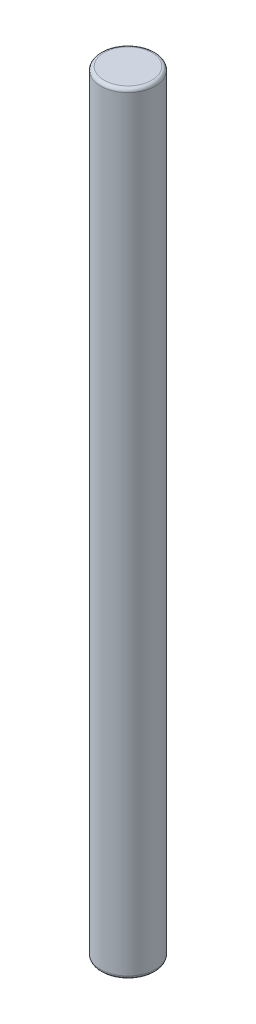
ISO-10303-21;
HEADER;
FILE_DESCRIPTION(('STEP AP214'),'2;1');
FILE_NAME('part.step','',(''),(''),'','','');
FILE_SCHEMA(('AUTOMOTIVE_DESIGN { 1 0 10303 214 1 1 1 1 }'));
ENDSEC;
DATA;
#1=APPLICATION_CONTEXT('core data for automotive mechanical design processes');
#2=APPLICATION_PROTOCOL_DEFINITION('international standard','automotive_design',2000,#1);
#3=PRODUCT_CONTEXT('',#1,'mechanical');
#4=PRODUCT('Part','Part','',(#3));
#5=PRODUCT_RELATED_PRODUCT_CATEGORY('part','',(#4));
#6=PRODUCT_DEFINITION_FORMATION('','',#4);
#7=PRODUCT_DEFINITION_CONTEXT('part definition',#1,'design');
#8=PRODUCT_DEFINITION('design','',#6,#7);
#9=PRODUCT_DEFINITION_SHAPE('','',#8);
#10=(LENGTH_UNIT() NAMED_UNIT(*) SI_UNIT(.MILLI.,.METRE.));
#11=(NAMED_UNIT(*) PLANE_ANGLE_UNIT() SI_UNIT($,.RADIAN.));
#12=(NAMED_UNIT(*) SI_UNIT($,.STERADIAN.) SOLID_ANGLE_UNIT());
#13=UNCERTAINTY_MEASURE_WITH_UNIT(LENGTH_MEASURE(1.E-05),#10,'distance_accuracy_value','');
#14=(GEOMETRIC_REPRESENTATION_CONTEXT(3) GLOBAL_UNCERTAINTY_ASSIGNED_CONTEXT((#13)) GLOBAL_UNIT_ASSIGNED_CONTEXT((#10,
#11,#12)) REPRESENTATION_CONTEXT('',''));
#15=CARTESIAN_POINT('',(0.,0.,0.));
#16=DIRECTION('',(0.,0.,1.));
#17=DIRECTION('',(1.,0.,0.));
#18=AXIS2_PLACEMENT_3D('',#15,#16,#17);
#19=CARTESIAN_POINT('',(0.,113.,0.));
#20=DIRECTION('',(0.,-1.,0.));
#21=DIRECTION('',(0.,0.,-1.));
#22=AXIS2_PLACEMENT_3D('',#19,#20,#21);
#23=CYLINDRICAL_SURFACE('',#22,4.);
#24=CARTESIAN_POINT('',(0.,0.5,0.));
#25=DIRECTION('',(0.,1.,0.));
#26=DIRECTION('',(0.,0.,1.));
#27=AXIS2_PLACEMENT_3D('',#24,#25,#26);
#28=CIRCLE('',#27,4.);
#29=CARTESIAN_POINT('',(0.,0.5,4.));
#30=VERTEX_POINT('',#29);
#31=EDGE_CURVE('E38',#30,#30,#28,.T.);
#32=ORIENTED_EDGE('',*,*,#31,.T.);
#33=EDGE_LOOP('',(#32));
#34=FACE_BOUND('',#33,.T.);
#35=CARTESIAN_POINT('',(0.,112.5,0.));
#36=DIRECTION('',(0.,1.,0.));
#37=DIRECTION('',(0.,0.,1.));
#38=AXIS2_PLACEMENT_3D('',#35,#36,#37);
#39=CIRCLE('',#38,4.);
#40=CARTESIAN_POINT('',(0.,112.5,4.));
#41=VERTEX_POINT('',#40);
#42=EDGE_CURVE('E42',#41,#41,#39,.F.);
#43=ORIENTED_EDGE('',*,*,#42,.T.);
#44=EDGE_LOOP('',(#43));
#45=FACE_BOUND('',#44,.T.);
#46=ADVANCED_FACE('F31',(#34,#45),#23,.T.);
#47=CARTESIAN_POINT('',(0.,113.,0.));
#48=DIRECTION('',(0.,1.,0.));
#49=DIRECTION('',(0.,0.,1.));
#50=AXIS2_PLACEMENT_3D('',#47,#48,#49);
#51=PLANE('',#50);
#52=CARTESIAN_POINT('',(0.,113.,0.));
#53=DIRECTION('',(0.,1.,0.));
#54=DIRECTION('',(0.,0.,1.));
#55=AXIS2_PLACEMENT_3D('',#52,#53,#54);
#56=CIRCLE('',#55,3.5);
#57=CARTESIAN_POINT('',(0.,113.,3.5));
#58=VERTEX_POINT('',#57);
#59=EDGE_CURVE('E46',#58,#58,#56,.T.);
#60=ORIENTED_EDGE('',*,*,#59,.T.);
#61=EDGE_LOOP('',(#60));
#62=FACE_BOUND('',#61,.T.);
#63=ADVANCED_FACE('F52',(#62),#51,.T.);
#64=CARTESIAN_POINT('',(0.,0.,0.));
#65=DIRECTION('',(0.,1.,0.));
#66=DIRECTION('',(0.,0.,1.));
#67=AXIS2_PLACEMENT_3D('',#64,#65,#66);
#68=PLANE('',#67);
#69=CARTESIAN_POINT('',(0.,0.,0.));
#70=DIRECTION('',(0.,1.,0.));
#71=DIRECTION('',(0.,0.,1.));
#72=AXIS2_PLACEMENT_3D('',#69,#70,#71);
#73=CIRCLE('',#72,3.5);
#74=CARTESIAN_POINT('',(0.,0.,3.5));
#75=VERTEX_POINT('',#74);
#76=EDGE_CURVE('E10',#75,#75,#73,.F.);
#77=ORIENTED_EDGE('',*,*,#76,.T.);
#78=EDGE_LOOP('',(#77));
#79=FACE_BOUND('',#78,.T.);
#80=ADVANCED_FACE('F56',(#79),#68,.F.);
#81=CARTESIAN_POINT('',(0.,112.5,0.));
#82=DIRECTION('',(0.,1.,0.));
#83=DIRECTION('',(0.,0.,1.));
#84=AXIS2_PLACEMENT_3D('',#81,#82,#83);
#85=TOROIDAL_SURFACE('',#84,3.5,0.5);
#86=ORIENTED_EDGE('',*,*,#42,.F.);
#87=EDGE_LOOP('',(#86));
#88=FACE_BOUND('',#87,.T.);
#89=ORIENTED_EDGE('',*,*,#59,.F.);
#90=EDGE_LOOP('',(#89));
#91=FACE_BOUND('',#90,.T.);
#92=ADVANCED_FACE('F54',(#88,#91),#85,.T.);
#93=CARTESIAN_POINT('',(0.,0.5,0.));
#94=DIRECTION('',(0.,1.,0.));
#95=DIRECTION('',(0.,0.,1.));
#96=AXIS2_PLACEMENT_3D('',#93,#94,#95);
#97=TOROIDAL_SURFACE('',#96,3.5,0.5);
#98=ORIENTED_EDGE('',*,*,#76,.F.);
#99=EDGE_LOOP('',(#98));
#100=FACE_BOUND('',#99,.T.);
#101=ORIENTED_EDGE('',*,*,#31,.F.);
#102=EDGE_LOOP('',(#101));
#103=FACE_BOUND('',#102,.T.);
#104=ADVANCED_FACE('F33',(#100,#103),#97,.T.);
#105=CLOSED_SHELL('',(#46,#63,#80,#92,#104));
#106=MANIFOLD_SOLID_BREP('B2',#105);
#107=ADVANCED_BREP_SHAPE_REPRESENTATION('',(#18,#106),#14);
#108=SHAPE_DEFINITION_REPRESENTATION(#9,#107);
ENDSEC;
END-ISO-10303-21;
